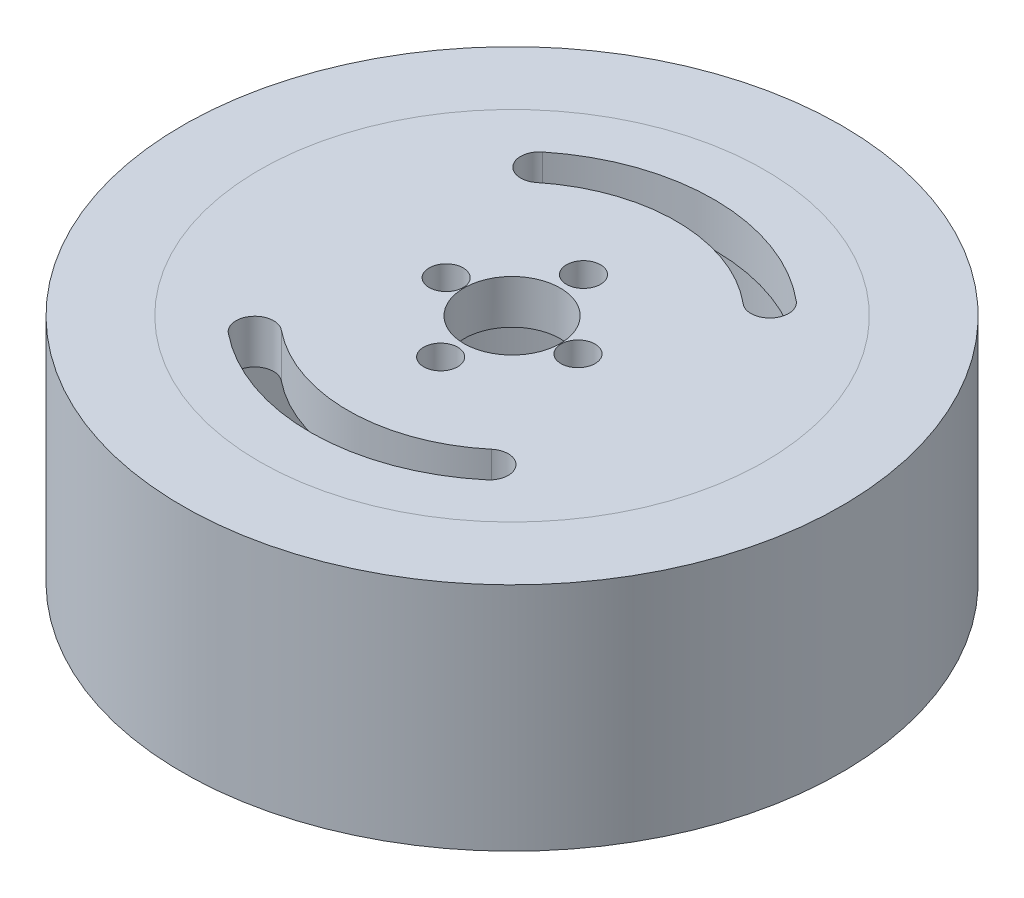
ISO-10303-21;
HEADER;
FILE_DESCRIPTION(('STEP AP214'),'2;1');
FILE_NAME('part.step','',(''),(''),'','','');
FILE_SCHEMA(('AUTOMOTIVE_DESIGN { 1 0 10303 214 1 1 1 1 }'));
ENDSEC;
DATA;
#1=APPLICATION_CONTEXT('core data for automotive mechanical design processes');
#2=APPLICATION_PROTOCOL_DEFINITION('international standard','automotive_design',2000,#1);
#3=PRODUCT_CONTEXT('',#1,'mechanical');
#4=PRODUCT('Part','Part','',(#3));
#5=PRODUCT_RELATED_PRODUCT_CATEGORY('part','',(#4));
#6=PRODUCT_DEFINITION_FORMATION('','',#4);
#7=PRODUCT_DEFINITION_CONTEXT('part definition',#1,'design');
#8=PRODUCT_DEFINITION('design','',#6,#7);
#9=PRODUCT_DEFINITION_SHAPE('','',#8);
#10=(LENGTH_UNIT() NAMED_UNIT(*) SI_UNIT(.MILLI.,.METRE.));
#11=(NAMED_UNIT(*) PLANE_ANGLE_UNIT() SI_UNIT($,.RADIAN.));
#12=(NAMED_UNIT(*) SI_UNIT($,.STERADIAN.) SOLID_ANGLE_UNIT());
#13=UNCERTAINTY_MEASURE_WITH_UNIT(LENGTH_MEASURE(1.E-05),#10,'distance_accuracy_value','');
#14=(GEOMETRIC_REPRESENTATION_CONTEXT(3) GLOBAL_UNCERTAINTY_ASSIGNED_CONTEXT((#13)) GLOBAL_UNIT_ASSIGNED_CONTEXT((#10,
#11,#12)) REPRESENTATION_CONTEXT('',''));
#15=CARTESIAN_POINT('',(0.,0.,0.));
#16=DIRECTION('',(0.,0.,1.));
#17=DIRECTION('',(1.,0.,0.));
#18=AXIS2_PLACEMENT_3D('',#15,#16,#17);
#19=CARTESIAN_POINT('',(0.,21.,0.));
#20=DIRECTION('',(0.,1.,0.));
#21=DIRECTION('',(0.,0.,1.));
#22=AXIS2_PLACEMENT_3D('',#19,#20,#21);
#23=PLANE('',#22);
#24=CARTESIAN_POINT('',(0.,21.,0.));
#25=DIRECTION('',(0.,1.,0.));
#26=DIRECTION('',(0.,0.,1.));
#27=AXIS2_PLACEMENT_3D('',#24,#25,#26);
#28=CIRCLE('',#27,30.);
#29=CARTESIAN_POINT('',(0.,21.,-30.));
#30=VERTEX_POINT('',#29);
#31=EDGE_CURVE('E180',#30,#30,#28,.T.);
#32=ORIENTED_EDGE('',*,*,#31,.T.);
#33=EDGE_LOOP('',(#32));
#34=FACE_BOUND('',#33,.T.);
#35=CARTESIAN_POINT('',(0.,21.,0.));
#36=DIRECTION('',(0.,1.,0.));
#37=DIRECTION('',(0.,0.,1.));
#38=AXIS2_PLACEMENT_3D('',#35,#36,#37);
#39=CIRCLE('',#38,23.);
#40=CARTESIAN_POINT('',(0.,21.,23.));
#41=VERTEX_POINT('',#40);
#42=EDGE_CURVE('E186',#41,#41,#39,.F.);
#43=ORIENTED_EDGE('',*,*,#42,.T.);
#44=EDGE_LOOP('',(#43));
#45=FACE_BOUND('',#44,.T.);
#46=ADVANCED_FACE('F40',(#34,#45),#23,.T.);
#47=CARTESIAN_POINT('',(0.,0.,0.));
#48=DIRECTION('',(0.,1.,0.));
#49=DIRECTION('',(0.,0.,1.));
#50=AXIS2_PLACEMENT_3D('',#47,#48,#49);
#51=PLANE('',#50);
#52=CARTESIAN_POINT('',(0.,0.,0.));
#53=DIRECTION('',(0.,1.,0.));
#54=DIRECTION('',(0.,0.,1.));
#55=AXIS2_PLACEMENT_3D('',#52,#53,#54);
#56=CIRCLE('',#55,30.);
#57=CARTESIAN_POINT('',(0.,0.,-30.));
#58=VERTEX_POINT('',#57);
#59=EDGE_CURVE('E176',#58,#58,#56,.T.);
#60=ORIENTED_EDGE('',*,*,#59,.F.);
#61=EDGE_LOOP('',(#60));
#62=FACE_BOUND('',#61,.T.);
#63=CARTESIAN_POINT('',(0.,0.,0.));
#64=DIRECTION('',(0.,1.,0.));
#65=DIRECTION('',(0.,0.,1.));
#66=AXIS2_PLACEMENT_3D('',#63,#64,#65);
#67=CIRCLE('',#66,23.);
#68=CARTESIAN_POINT('',(0.,0.,23.));
#69=VERTEX_POINT('',#68);
#70=EDGE_CURVE('E183',#69,#69,#67,.F.);
#71=ORIENTED_EDGE('',*,*,#70,.F.);
#72=EDGE_LOOP('',(#71));
#73=FACE_BOUND('',#72,.T.);
#74=ADVANCED_FACE('F253',(#62,#73),#51,.F.);
#75=CARTESIAN_POINT('',(0.,21.,0.));
#76=DIRECTION('',(0.,-1.,0.));
#77=DIRECTION('',(0.,0.,-1.));
#78=AXIS2_PLACEMENT_3D('',#75,#76,#77);
#79=CYLINDRICAL_SURFACE('',#78,30.);
#80=CARTESIAN_POINT('',(0.,21.,-30.));
#81=CARTESIAN_POINT('',(0.,20.78125,-30.));
#82=CARTESIAN_POINT('',(0.,20.5625,-30.));
#83=CARTESIAN_POINT('',(0.,20.125,-30.));
#84=CARTESIAN_POINT('',(0.,19.90625,-30.));
#85=CARTESIAN_POINT('',(0.,19.46875,-30.));
#86=CARTESIAN_POINT('',(0.,19.25,-30.));
#87=CARTESIAN_POINT('',(0.,18.8125,-30.));
#88=CARTESIAN_POINT('',(0.,18.59375,-30.));
#89=CARTESIAN_POINT('',(0.,18.15625,-30.));
#90=CARTESIAN_POINT('',(0.,17.9375,-30.));
#91=CARTESIAN_POINT('',(0.,17.5,-30.));
#92=CARTESIAN_POINT('',(0.,17.28125,-30.));
#93=CARTESIAN_POINT('',(0.,16.84375,-30.));
#94=CARTESIAN_POINT('',(0.,16.625,-30.));
#95=CARTESIAN_POINT('',(0.,16.1875,-30.));
#96=CARTESIAN_POINT('',(0.,15.96875,-30.));
#97=CARTESIAN_POINT('',(0.,15.53125,-30.));
#98=CARTESIAN_POINT('',(0.,15.3125,-30.));
#99=CARTESIAN_POINT('',(0.,14.875,-30.));
#100=CARTESIAN_POINT('',(0.,14.65625,-30.));
#101=CARTESIAN_POINT('',(0.,14.21875,-30.));
#102=CARTESIAN_POINT('',(0.,14.,-30.));
#103=CARTESIAN_POINT('',(0.,13.5625,-30.));
#104=CARTESIAN_POINT('',(0.,13.34375,-30.));
#105=CARTESIAN_POINT('',(0.,12.90625,-30.));
#106=CARTESIAN_POINT('',(0.,12.6875,-30.));
#107=CARTESIAN_POINT('',(0.,12.25,-30.));
#108=CARTESIAN_POINT('',(0.,12.03125,-30.));
#109=CARTESIAN_POINT('',(0.,11.59375,-30.));
#110=CARTESIAN_POINT('',(0.,11.375,-30.));
#111=CARTESIAN_POINT('',(0.,10.9375,-30.));
#112=CARTESIAN_POINT('',(0.,10.71875,-30.));
#113=CARTESIAN_POINT('',(0.,10.28125,-30.));
#114=CARTESIAN_POINT('',(0.,10.0625,-30.));
#115=CARTESIAN_POINT('',(0.,9.625,-30.));
#116=CARTESIAN_POINT('',(0.,9.40625,-30.));
#117=CARTESIAN_POINT('',(0.,8.96875,-30.));
#118=CARTESIAN_POINT('',(0.,8.75,-30.));
#119=CARTESIAN_POINT('',(0.,8.3125,-30.));
#120=CARTESIAN_POINT('',(0.,8.09375,-30.));
#121=CARTESIAN_POINT('',(0.,7.65625,-30.));
#122=CARTESIAN_POINT('',(0.,7.4375,-30.));
#123=CARTESIAN_POINT('',(0.,7.,-30.));
#124=CARTESIAN_POINT('',(0.,6.78125,-30.));
#125=CARTESIAN_POINT('',(0.,6.34375,-30.));
#126=CARTESIAN_POINT('',(0.,6.125,-30.));
#127=CARTESIAN_POINT('',(0.,5.6875,-30.));
#128=CARTESIAN_POINT('',(0.,5.46875,-30.));
#129=CARTESIAN_POINT('',(0.,5.03125,-30.));
#130=CARTESIAN_POINT('',(0.,4.8125,-30.));
#131=CARTESIAN_POINT('',(0.,4.375,-30.));
#132=CARTESIAN_POINT('',(0.,4.15625,-30.));
#133=CARTESIAN_POINT('',(0.,3.71875,-30.));
#134=CARTESIAN_POINT('',(0.,3.5,-30.));
#135=CARTESIAN_POINT('',(0.,3.0625,-30.));
#136=CARTESIAN_POINT('',(0.,2.84375,-30.));
#137=CARTESIAN_POINT('',(0.,2.40625,-30.));
#138=CARTESIAN_POINT('',(0.,2.1875,-30.));
#139=CARTESIAN_POINT('',(0.,1.75,-30.));
#140=CARTESIAN_POINT('',(0.,1.53125,-30.));
#141=CARTESIAN_POINT('',(0.,1.09375,-30.));
#142=CARTESIAN_POINT('',(0.,0.875000000000001,-30.));
#143=CARTESIAN_POINT('',(0.,0.4375,-30.));
#144=CARTESIAN_POINT('',(0.,0.21875,-30.));
#145=CARTESIAN_POINT('',(0.,0.,-30.));
#146=B_SPLINE_CURVE_WITH_KNOTS('',3,(#80,#81,#82,#83,#84,#85,#86,#87,#88,#89,#90,#91,#92,#93,
#94,#95,#96,#97,#98,#99,#100,#101,#102,#103,#104,#105,#106,#107,#108,#109,#110,#111,#112,#113,
#114,#115,#116,#117,#118,#119,#120,#121,#122,#123,#124,#125,#126,#127,#128,#129,#130,#131,#132,
#133,#134,#135,#136,#137,#138,#139,#140,#141,#142,#143,#144,#145),.UNSPECIFIED.,.F.,.F.,(4,2,2,
2,2,2,2,2,2,2,2,2,2,2,2,2,2,2,2,2,2,2,2,2,2,2,2,2,2,2,2,2,4),(0.,0.656249999999997,1.3125,
1.96875,2.625,3.28125,3.9375,4.59375,5.25,5.90625,6.5625,7.21875,7.875,8.53125,9.1875,9.84375,
10.5,11.15625,11.8125,12.46875,13.125,13.78125,14.4375,15.09375,15.75,16.40625,17.0625,17.71875,
18.375,19.03125,19.6875,20.34375,21.),.UNSPECIFIED.);
#147=EDGE_CURVE('BSEAM42',#30,#58,#146,.T.);
#148=ORIENTED_EDGE('',*,*,#31,.F.);
#149=ORIENTED_EDGE('',*,*,#59,.T.);
#150=ORIENTED_EDGE('',*,*,#147,.T.);
#151=ORIENTED_EDGE('',*,*,#147,.F.);
#152=EDGE_LOOP('',(#148,#150,#149,#151));
#153=FACE_BOUND('',#152,.T.);
#154=ADVANCED_FACE('F42',(#153),#79,.T.);
#155=CARTESIAN_POINT('',(0.,21.,0.));
#156=DIRECTION('',(0.,1.,0.));
#157=DIRECTION('',(0.,0.,1.));
#158=AXIS2_PLACEMENT_3D('',#155,#156,#157);
#159=CIRCLE('',#158,4.38448940135771);
#160=CARTESIAN_POINT('',(0.,21.,4.38448940135771));
#161=VERTEX_POINT('',#160);
#162=EDGE_CURVE('E137',#161,#161,#159,.T.);
#163=ORIENTED_EDGE('',*,*,#162,.F.);
#164=EDGE_LOOP('',(#163));
#165=FACE_BOUND('',#164,.T.);
#166=CARTESIAN_POINT('',(0.,21.,6.5));
#167=DIRECTION('',(0.,1.,0.));
#168=DIRECTION('',(0.,0.,1.));
#169=AXIS2_PLACEMENT_3D('',#166,#167,#168);
#170=CIRCLE('',#169,1.55);
#171=CARTESIAN_POINT('',(0.,21.,8.05));
#172=VERTEX_POINT('',#171);
#173=EDGE_CURVE('E158',#172,#172,#170,.T.);
#174=ORIENTED_EDGE('',*,*,#173,.F.);
#175=EDGE_LOOP('',(#174));
#176=FACE_BOUND('',#175,.T.);
#177=CARTESIAN_POINT('',(6.,21.,0.));
#178=DIRECTION('',(0.,1.,0.));
#179=DIRECTION('',(0.,0.,1.));
#180=AXIS2_PLACEMENT_3D('',#177,#178,#179);
#181=CIRCLE('',#180,1.55);
#182=CARTESIAN_POINT('',(6.,21.,1.55));
#183=VERTEX_POINT('',#182);
#184=EDGE_CURVE('E161',#183,#183,#181,.T.);
#185=ORIENTED_EDGE('',*,*,#184,.F.);
#186=EDGE_LOOP('',(#185));
#187=FACE_BOUND('',#186,.T.);
#188=CARTESIAN_POINT('',(0.,21.,-6.5));
#189=DIRECTION('',(0.,1.,0.));
#190=DIRECTION('',(0.,0.,1.));
#191=AXIS2_PLACEMENT_3D('',#188,#189,#190);
#192=CIRCLE('',#191,1.55);
#193=CARTESIAN_POINT('',(0.,21.,-4.95));
#194=VERTEX_POINT('',#193);
#195=EDGE_CURVE('E164',#194,#194,#192,.T.);
#196=ORIENTED_EDGE('',*,*,#195,.F.);
#197=EDGE_LOOP('',(#196));
#198=FACE_BOUND('',#197,.T.);
#199=CARTESIAN_POINT('',(10.6968094714254,21.,-12.7632385738599));
#200=DIRECTION('',(0.,1.,0.));
#201=DIRECTION('',(0.,0.,1.));
#202=AXIS2_PLACEMENT_3D('',#199,#200,#201);
#203=CIRCLE('',#202,1.71459798128408);
#204=CARTESIAN_POINT('',(9.5954618630093,21.,-11.4491306319998));
#205=VERTEX_POINT('',#204);
#206=CARTESIAN_POINT('',(11.7981570798414,21.,-14.0773465157199));
#207=VERTEX_POINT('',#206);
#208=EDGE_CURVE('E57',#205,#207,#203,.T.);
#209=ORIENTED_EDGE('',*,*,#208,.F.);
#210=CARTESIAN_POINT('',(0.,21.,0.));
#211=DIRECTION('',(0.,-1.,0.));
#212=DIRECTION('',(0.,0.,1.));
#213=AXIS2_PLACEMENT_3D('',#210,#211,#212);
#214=CIRCLE('',#213,14.9383894912759);
#215=CARTESIAN_POINT('',(-9.38549104250814,21.,-11.6218775799809));
#216=VERTEX_POINT('',#215);
#217=EDGE_CURVE('E130',#216,#205,#214,.T.);
#218=ORIENTED_EDGE('',*,*,#217,.F.);
#219=CARTESIAN_POINT('',(-10.4627386269444,21.,-12.955813065396));
#220=DIRECTION('',(0.,1.,0.));
#221=DIRECTION('',(0.,0.,1.));
#222=AXIS2_PLACEMENT_3D('',#219,#220,#221);
#223=CIRCLE('',#222,1.71459798128408);
#224=CARTESIAN_POINT('',(-11.5399862113806,21.,-14.2897485508112));
#225=VERTEX_POINT('',#224);
#226=EDGE_CURVE('E113',#225,#216,#223,.T.);
#227=ORIENTED_EDGE('',*,*,#226,.F.);
#228=CARTESIAN_POINT('',(0.,21.,0.));
#229=DIRECTION('',(0.,1.,0.));
#230=DIRECTION('',(0.,0.,1.));
#231=AXIS2_PLACEMENT_3D('',#228,#229,#230);
#232=CIRCLE('',#231,18.3675854538441);
#233=EDGE_CURVE('E123',#207,#225,#232,.T.);
#234=ORIENTED_EDGE('',*,*,#233,.F.);
#235=EDGE_LOOP('',(#209,#218,#227,#234));
#236=FACE_BOUND('',#235,.T.);
#237=CARTESIAN_POINT('',(10.6968094714254,21.,12.7632385738599));
#238=DIRECTION('',(0.,1.,0.));
#239=DIRECTION('',(0.,0.,-1.));
#240=AXIS2_PLACEMENT_3D('',#237,#238,#239);
#241=CIRCLE('',#240,1.71459798128409);
#242=CARTESIAN_POINT('',(11.7981570798414,21.,14.0773465157199));
#243=VERTEX_POINT('',#242);
#244=CARTESIAN_POINT('',(9.59546186300931,21.,11.4491306319998));
#245=VERTEX_POINT('',#244);
#246=EDGE_CURVE('E65',#243,#245,#241,.T.);
#247=ORIENTED_EDGE('',*,*,#246,.F.);
#248=CARTESIAN_POINT('',(0.,21.,0.));
#249=DIRECTION('',(0.,1.,0.));
#250=DIRECTION('',(0.,0.,-1.));
#251=AXIS2_PLACEMENT_3D('',#248,#249,#250);
#252=CIRCLE('',#251,18.3675854538441);
#253=CARTESIAN_POINT('',(-11.5399862113806,21.,14.2897485508112));
#254=VERTEX_POINT('',#253);
#255=EDGE_CURVE('E147',#254,#243,#252,.T.);
#256=ORIENTED_EDGE('',*,*,#255,.F.);
#257=CARTESIAN_POINT('',(-10.4627386269443,21.,12.955813065396));
#258=DIRECTION('',(0.,1.,0.));
#259=DIRECTION('',(0.,0.,-1.));
#260=AXIS2_PLACEMENT_3D('',#257,#258,#259);
#261=CIRCLE('',#260,1.71459798128408);
#262=CARTESIAN_POINT('',(-9.38549104250813,21.,11.6218775799809));
#263=VERTEX_POINT('',#262);
#264=EDGE_CURVE('E144',#263,#254,#261,.T.);
#265=ORIENTED_EDGE('',*,*,#264,.F.);
#266=CARTESIAN_POINT('',(0.,21.,0.));
#267=DIRECTION('',(0.,-1.,0.));
#268=DIRECTION('',(0.,0.,-1.));
#269=AXIS2_PLACEMENT_3D('',#266,#267,#268);
#270=CIRCLE('',#269,14.9383894912759);
#271=EDGE_CURVE('E141',#245,#263,#270,.T.);
#272=ORIENTED_EDGE('',*,*,#271,.F.);
#273=EDGE_LOOP('',(#247,#256,#265,#272));
#274=FACE_BOUND('',#273,.T.);
#275=CARTESIAN_POINT('',(-6.,21.,0.));
#276=DIRECTION('',(0.,1.,0.));
#277=DIRECTION('',(0.,0.,1.));
#278=AXIS2_PLACEMENT_3D('',#275,#276,#277);
#279=CIRCLE('',#278,1.55);
#280=CARTESIAN_POINT('',(-6.,21.,1.55));
#281=VERTEX_POINT('',#280);
#282=EDGE_CURVE('E167',#281,#281,#279,.T.);
#283=ORIENTED_EDGE('',*,*,#282,.F.);
#284=EDGE_LOOP('',(#283));
#285=FACE_BOUND('',#284,.T.);
#286=ORIENTED_EDGE('',*,*,#42,.F.);
#287=EDGE_LOOP('',(#286));
#288=FACE_BOUND('',#287,.T.);
#289=ADVANCED_FACE('F127',(#165,#176,#187,#198,#236,#274,#285,#288),#23,.T.);
#290=ORIENTED_EDGE('',*,*,#70,.T.);
#291=EDGE_LOOP('',(#290));
#292=FACE_BOUND('',#291,.T.);
#293=CARTESIAN_POINT('',(0.,0.,0.));
#294=DIRECTION('',(0.,-1.,0.));
#295=DIRECTION('',(0.,0.,-1.));
#296=AXIS2_PLACEMENT_3D('',#293,#294,#295);
#297=CIRCLE('',#296,21.);
#298=CARTESIAN_POINT('',(0.,0.,-21.));
#299=VERTEX_POINT('',#298);
#300=EDGE_CURVE('E177',#299,#299,#297,.T.);
#301=ORIENTED_EDGE('',*,*,#300,.F.);
#302=EDGE_LOOP('',(#301));
#303=FACE_BOUND('',#302,.T.);
#304=ADVANCED_FACE('F247',(#292,#303),#51,.F.);
#305=CARTESIAN_POINT('',(0.,17.,0.));
#306=DIRECTION('',(0.,-1.,0.));
#307=DIRECTION('',(0.,0.,-1.));
#308=AXIS2_PLACEMENT_3D('',#305,#306,#307);
#309=CYLINDRICAL_SURFACE('',#308,21.);
#310=CARTESIAN_POINT('',(0.,17.,0.));
#311=DIRECTION('',(0.,-1.,0.));
#312=DIRECTION('',(0.,0.,-1.));
#313=AXIS2_PLACEMENT_3D('',#310,#311,#312);
#314=CIRCLE('',#313,21.);
#315=CARTESIAN_POINT('',(0.,17.,-21.));
#316=VERTEX_POINT('',#315);
#317=EDGE_CURVE('E173',#316,#316,#314,.T.);
#318=ORIENTED_EDGE('',*,*,#317,.F.);
#319=EDGE_LOOP('',(#318));
#320=FACE_BOUND('',#319,.T.);
#321=ORIENTED_EDGE('',*,*,#300,.T.);
#322=EDGE_LOOP('',(#321));
#323=FACE_BOUND('',#322,.T.);
#324=ADVANCED_FACE('F227',(#320,#323),#309,.F.);
#325=CARTESIAN_POINT('',(0.,17.,0.));
#326=DIRECTION('',(0.,-1.,0.));
#327=DIRECTION('',(0.,0.,-1.));
#328=AXIS2_PLACEMENT_3D('',#325,#326,#327);
#329=PLANE('',#328);
#330=CARTESIAN_POINT('',(0.,17.,0.));
#331=DIRECTION('',(0.,-1.,0.));
#332=DIRECTION('',(0.,0.,-1.));
#333=AXIS2_PLACEMENT_3D('',#330,#331,#332);
#334=CIRCLE('',#333,4.38448940135771);
#335=CARTESIAN_POINT('',(0.,17.,-4.38448940135771));
#336=VERTEX_POINT('',#335);
#337=EDGE_CURVE('E44',#336,#336,#334,.T.);
#338=ORIENTED_EDGE('',*,*,#337,.F.);
#339=EDGE_LOOP('',(#338));
#340=FACE_BOUND('',#339,.T.);
#341=CARTESIAN_POINT('',(0.,17.,6.5));
#342=DIRECTION('',(0.,-1.,0.));
#343=DIRECTION('',(0.,0.,-1.));
#344=AXIS2_PLACEMENT_3D('',#341,#342,#343);
#345=CIRCLE('',#344,1.55);
#346=CARTESIAN_POINT('',(0.,17.,4.95));
#347=VERTEX_POINT('',#346);
#348=EDGE_CURVE('E213',#347,#347,#345,.T.);
#349=ORIENTED_EDGE('',*,*,#348,.F.);
#350=EDGE_LOOP('',(#349));
#351=FACE_BOUND('',#350,.T.);
#352=CARTESIAN_POINT('',(6.,17.,0.));
#353=DIRECTION('',(0.,-1.,0.));
#354=DIRECTION('',(0.,0.,-1.));
#355=AXIS2_PLACEMENT_3D('',#352,#353,#354);
#356=CIRCLE('',#355,1.55);
#357=CARTESIAN_POINT('',(6.,17.,-1.55));
#358=VERTEX_POINT('',#357);
#359=EDGE_CURVE('E211',#358,#358,#356,.T.);
#360=ORIENTED_EDGE('',*,*,#359,.F.);
#361=EDGE_LOOP('',(#360));
#362=FACE_BOUND('',#361,.T.);
#363=CARTESIAN_POINT('',(0.,17.,-6.5));
#364=DIRECTION('',(0.,-1.,0.));
#365=DIRECTION('',(0.,0.,-1.));
#366=AXIS2_PLACEMENT_3D('',#363,#364,#365);
#367=CIRCLE('',#366,1.55);
#368=CARTESIAN_POINT('',(0.,17.,-8.05));
#369=VERTEX_POINT('',#368);
#370=EDGE_CURVE('E196',#369,#369,#367,.T.);
#371=ORIENTED_EDGE('',*,*,#370,.F.);
#372=EDGE_LOOP('',(#371));
#373=FACE_BOUND('',#372,.T.);
#374=CARTESIAN_POINT('',(10.6968094714254,17.,-12.7632385738599));
#375=DIRECTION('',(0.,-1.,0.));
#376=DIRECTION('',(0.,0.,-1.));
#377=AXIS2_PLACEMENT_3D('',#374,#375,#376);
#378=CIRCLE('',#377,1.71459798128408);
#379=CARTESIAN_POINT('',(11.7981570798414,17.,-14.0773465157199));
#380=VERTEX_POINT('',#379);
#381=CARTESIAN_POINT('',(9.5954618630093,17.,-11.4491306319998));
#382=VERTEX_POINT('',#381);
#383=EDGE_CURVE('E11',#380,#382,#378,.T.);
#384=ORIENTED_EDGE('',*,*,#383,.F.);
#385=CARTESIAN_POINT('',(0.,17.,0.));
#386=DIRECTION('',(0.,-1.,0.));
#387=DIRECTION('',(0.,0.,-1.));
#388=AXIS2_PLACEMENT_3D('',#385,#386,#387);
#389=CIRCLE('',#388,18.3675854538441);
#390=CARTESIAN_POINT('',(-11.5399862113806,17.,-14.2897485508112));
#391=VERTEX_POINT('',#390);
#392=EDGE_CURVE('E205',#391,#380,#389,.T.);
#393=ORIENTED_EDGE('',*,*,#392,.F.);
#394=CARTESIAN_POINT('',(-10.4627386269444,17.,-12.955813065396));
#395=DIRECTION('',(0.,-1.,0.));
#396=DIRECTION('',(0.,0.,-1.));
#397=AXIS2_PLACEMENT_3D('',#394,#395,#396);
#398=CIRCLE('',#397,1.71459798128408);
#399=CARTESIAN_POINT('',(-9.38549104250814,17.,-11.6218775799809));
#400=VERTEX_POINT('',#399);
#401=EDGE_CURVE('E116',#400,#391,#398,.T.);
#402=ORIENTED_EDGE('',*,*,#401,.F.);
#403=CARTESIAN_POINT('',(0.,17.,0.));
#404=DIRECTION('',(0.,-1.,0.));
#405=DIRECTION('',(0.,0.,-1.));
#406=AXIS2_PLACEMENT_3D('',#403,#404,#405);
#407=CIRCLE('',#406,14.9383894912759);
#408=EDGE_CURVE('E49',#382,#400,#407,.F.);
#409=ORIENTED_EDGE('',*,*,#408,.F.);
#410=EDGE_LOOP('',(#384,#393,#402,#409));
#411=FACE_BOUND('',#410,.T.);
#412=CARTESIAN_POINT('',(10.6968094714254,17.,12.7632385738599));
#413=DIRECTION('',(0.,-1.,0.));
#414=DIRECTION('',(0.,0.,-1.));
#415=AXIS2_PLACEMENT_3D('',#412,#413,#414);
#416=CIRCLE('',#415,1.71459798128409);
#417=CARTESIAN_POINT('',(9.59546186300931,17.,11.4491306319998));
#418=VERTEX_POINT('',#417);
#419=CARTESIAN_POINT('',(11.7981570798414,17.,14.0773465157199));
#420=VERTEX_POINT('',#419);
#421=EDGE_CURVE('E203',#418,#420,#416,.T.);
#422=ORIENTED_EDGE('',*,*,#421,.F.);
#423=CARTESIAN_POINT('',(0.,17.,0.));
#424=DIRECTION('',(0.,-1.,0.));
#425=DIRECTION('',(0.,0.,-1.));
#426=AXIS2_PLACEMENT_3D('',#423,#424,#425);
#427=CIRCLE('',#426,14.9383894912759);
#428=CARTESIAN_POINT('',(-9.38549104250814,17.,11.6218775799809));
#429=VERTEX_POINT('',#428);
#430=EDGE_CURVE('E190',#429,#418,#427,.F.);
#431=ORIENTED_EDGE('',*,*,#430,.F.);
#432=CARTESIAN_POINT('',(-10.4627386269443,17.,12.955813065396));
#433=DIRECTION('',(0.,-1.,0.));
#434=DIRECTION('',(0.,0.,-1.));
#435=AXIS2_PLACEMENT_3D('',#432,#433,#434);
#436=CIRCLE('',#435,1.71459798128408);
#437=CARTESIAN_POINT('',(-11.5399862113806,17.,14.2897485508112));
#438=VERTEX_POINT('',#437);
#439=EDGE_CURVE('E198',#438,#429,#436,.T.);
#440=ORIENTED_EDGE('',*,*,#439,.F.);
#441=CARTESIAN_POINT('',(0.,17.,0.));
#442=DIRECTION('',(0.,-1.,0.));
#443=DIRECTION('',(0.,0.,-1.));
#444=AXIS2_PLACEMENT_3D('',#441,#442,#443);
#445=CIRCLE('',#444,18.3675854538441);
#446=EDGE_CURVE('E201',#420,#438,#445,.T.);
#447=ORIENTED_EDGE('',*,*,#446,.F.);
#448=EDGE_LOOP('',(#422,#431,#440,#447));
#449=FACE_BOUND('',#448,.T.);
#450=CARTESIAN_POINT('',(-6.,17.,0.));
#451=DIRECTION('',(0.,-1.,0.));
#452=DIRECTION('',(0.,0.,-1.));
#453=AXIS2_PLACEMENT_3D('',#450,#451,#452);
#454=CIRCLE('',#453,1.55);
#455=CARTESIAN_POINT('',(-6.,17.,-1.55));
#456=VERTEX_POINT('',#455);
#457=EDGE_CURVE('E172',#456,#456,#454,.T.);
#458=ORIENTED_EDGE('',*,*,#457,.F.);
#459=EDGE_LOOP('',(#458));
#460=FACE_BOUND('',#459,.T.);
#461=ORIENTED_EDGE('',*,*,#317,.T.);
#462=EDGE_LOOP('',(#461));
#463=FACE_BOUND('',#462,.T.);
#464=ADVANCED_FACE('F223',(#340,#351,#362,#373,#411,#449,#460,#463),#329,.T.);
#465=CARTESIAN_POINT('',(-6.,4.,0.));
#466=DIRECTION('',(0.,1.,0.));
#467=DIRECTION('',(0.,0.,1.));
#468=AXIS2_PLACEMENT_3D('',#465,#466,#467);
#469=CYLINDRICAL_SURFACE('',#468,1.55);
#470=ORIENTED_EDGE('',*,*,#457,.T.);
#471=EDGE_LOOP('',(#470));
#472=FACE_BOUND('',#471,.T.);
#473=ORIENTED_EDGE('',*,*,#282,.T.);
#474=EDGE_LOOP('',(#473));
#475=FACE_BOUND('',#474,.T.);
#476=ADVANCED_FACE('F226',(#472,#475),#469,.F.);
#477=CARTESIAN_POINT('',(10.6968094714254,4.,12.7632385738599));
#478=DIRECTION('',(0.,1.,0.));
#479=DIRECTION('',(0.,0.,1.));
#480=AXIS2_PLACEMENT_3D('',#477,#478,#479);
#481=CYLINDRICAL_SURFACE('',#480,1.71459798128409);
#482=ORIENTED_EDGE('',*,*,#421,.T.);
#483=DIRECTION('',(0.,1.,0.));
#484=VECTOR('',#483,1.);
#485=CARTESIAN_POINT('',(11.7981570798414,4.,14.0773465157199));
#486=LINE('',#485,#484);
#487=EDGE_CURVE('E151',#420,#243,#486,.T.);
#488=ORIENTED_EDGE('',*,*,#487,.T.);
#489=ORIENTED_EDGE('',*,*,#246,.T.);
#490=DIRECTION('',(0.,1.,0.));
#491=VECTOR('',#490,1.);
#492=CARTESIAN_POINT('',(9.59546186300931,4.,11.4491306319998));
#493=LINE('',#492,#491);
#494=EDGE_CURVE('E150',#418,#245,#493,.T.);
#495=ORIENTED_EDGE('',*,*,#494,.F.);
#496=EDGE_LOOP('',(#482,#488,#489,#495));
#497=FACE_BOUND('',#496,.T.);
#498=ADVANCED_FACE('F269',(#497),#481,.F.);
#499=CARTESIAN_POINT('',(0.,4.,0.));
#500=DIRECTION('',(0.,1.,0.));
#501=DIRECTION('',(0.,0.,1.));
#502=AXIS2_PLACEMENT_3D('',#499,#500,#501);
#503=CYLINDRICAL_SURFACE('',#502,18.3675854538441);
#504=ORIENTED_EDGE('',*,*,#446,.T.);
#505=DIRECTION('',(0.,1.,0.));
#506=VECTOR('',#505,1.);
#507=CARTESIAN_POINT('',(-11.5399862113806,4.,14.2897485508112));
#508=LINE('',#507,#506);
#509=EDGE_CURVE('E153',#438,#254,#508,.T.);
#510=ORIENTED_EDGE('',*,*,#509,.T.);
#511=ORIENTED_EDGE('',*,*,#255,.T.);
#512=ORIENTED_EDGE('',*,*,#487,.F.);
#513=EDGE_LOOP('',(#504,#510,#511,#512));
#514=FACE_BOUND('',#513,.T.);
#515=ADVANCED_FACE('F286',(#514),#503,.F.);
#516=CARTESIAN_POINT('',(-10.4627386269443,4.,12.955813065396));
#517=DIRECTION('',(0.,1.,0.));
#518=DIRECTION('',(0.,0.,1.));
#519=AXIS2_PLACEMENT_3D('',#516,#517,#518);
#520=CYLINDRICAL_SURFACE('',#519,1.71459798128408);
#521=ORIENTED_EDGE('',*,*,#439,.T.);
#522=DIRECTION('',(0.,1.,0.));
#523=VECTOR('',#522,1.);
#524=CARTESIAN_POINT('',(-9.38549104250813,4.,11.6218775799809));
#525=LINE('',#524,#523);
#526=EDGE_CURVE('E155',#429,#263,#525,.T.);
#527=ORIENTED_EDGE('',*,*,#526,.T.);
#528=ORIENTED_EDGE('',*,*,#264,.T.);
#529=ORIENTED_EDGE('',*,*,#509,.F.);
#530=EDGE_LOOP('',(#521,#527,#528,#529));
#531=FACE_BOUND('',#530,.T.);
#532=ADVANCED_FACE('F291',(#531),#520,.F.);
#533=CARTESIAN_POINT('',(0.,4.,0.));
#534=DIRECTION('',(0.,1.,0.));
#535=DIRECTION('',(0.,0.,1.));
#536=AXIS2_PLACEMENT_3D('',#533,#534,#535);
#537=CYLINDRICAL_SURFACE('',#536,14.9383894912759);
#538=ORIENTED_EDGE('',*,*,#430,.T.);
#539=ORIENTED_EDGE('',*,*,#494,.T.);
#540=ORIENTED_EDGE('',*,*,#271,.T.);
#541=ORIENTED_EDGE('',*,*,#526,.F.);
#542=EDGE_LOOP('',(#538,#539,#540,#541));
#543=FACE_BOUND('',#542,.T.);
#544=ADVANCED_FACE('F287',(#543),#537,.T.);
#545=CARTESIAN_POINT('',(10.6968094714254,4.,-12.7632385738599));
#546=DIRECTION('',(0.,1.,0.));
#547=DIRECTION('',(0.,0.,1.));
#548=AXIS2_PLACEMENT_3D('',#545,#546,#547);
#549=CYLINDRICAL_SURFACE('',#548,1.71459798128408);
#550=ORIENTED_EDGE('',*,*,#383,.T.);
#551=DIRECTION('',(0.,1.,0.));
#552=VECTOR('',#551,1.);
#553=CARTESIAN_POINT('',(9.5954618630093,4.,-11.4491306319998));
#554=LINE('',#553,#552);
#555=EDGE_CURVE('E135',#382,#205,#554,.T.);
#556=ORIENTED_EDGE('',*,*,#555,.T.);
#557=ORIENTED_EDGE('',*,*,#208,.T.);
#558=DIRECTION('',(0.,1.,0.));
#559=VECTOR('',#558,1.);
#560=CARTESIAN_POINT('',(11.7981570798414,4.,-14.0773465157199));
#561=LINE('',#560,#559);
#562=EDGE_CURVE('E120',#380,#207,#561,.T.);
#563=ORIENTED_EDGE('',*,*,#562,.F.);
#564=EDGE_LOOP('',(#550,#556,#557,#563));
#565=FACE_BOUND('',#564,.T.);
#566=ADVANCED_FACE('F290',(#565),#549,.F.);
#567=CARTESIAN_POINT('',(0.,4.,0.));
#568=DIRECTION('',(0.,1.,0.));
#569=DIRECTION('',(0.,0.,1.));
#570=AXIS2_PLACEMENT_3D('',#567,#568,#569);
#571=CYLINDRICAL_SURFACE('',#570,14.9383894912759);
#572=ORIENTED_EDGE('',*,*,#408,.T.);
#573=DIRECTION('',(0.,1.,0.));
#574=VECTOR('',#573,1.);
#575=CARTESIAN_POINT('',(-9.38549104250814,4.,-11.6218775799809));
#576=LINE('',#575,#574);
#577=EDGE_CURVE('E119',#400,#216,#576,.T.);
#578=ORIENTED_EDGE('',*,*,#577,.T.);
#579=ORIENTED_EDGE('',*,*,#217,.T.);
#580=ORIENTED_EDGE('',*,*,#555,.F.);
#581=EDGE_LOOP('',(#572,#578,#579,#580));
#582=FACE_BOUND('',#581,.T.);
#583=ADVANCED_FACE('F301',(#582),#571,.T.);
#584=CARTESIAN_POINT('',(-10.4627386269444,4.,-12.955813065396));
#585=DIRECTION('',(0.,1.,0.));
#586=DIRECTION('',(0.,0.,1.));
#587=AXIS2_PLACEMENT_3D('',#584,#585,#586);
#588=CYLINDRICAL_SURFACE('',#587,1.71459798128408);
#589=ORIENTED_EDGE('',*,*,#401,.T.);
#590=DIRECTION('',(0.,1.,0.));
#591=VECTOR('',#590,1.);
#592=CARTESIAN_POINT('',(-11.5399862113806,4.,-14.2897485508112));
#593=LINE('',#592,#591);
#594=EDGE_CURVE('E108',#391,#225,#593,.T.);
#595=ORIENTED_EDGE('',*,*,#594,.T.);
#596=ORIENTED_EDGE('',*,*,#226,.T.);
#597=ORIENTED_EDGE('',*,*,#577,.F.);
#598=EDGE_LOOP('',(#589,#595,#596,#597));
#599=FACE_BOUND('',#598,.T.);
#600=ADVANCED_FACE('F110',(#599),#588,.F.);
#601=CARTESIAN_POINT('',(0.,4.,0.));
#602=DIRECTION('',(0.,1.,0.));
#603=DIRECTION('',(0.,0.,1.));
#604=AXIS2_PLACEMENT_3D('',#601,#602,#603);
#605=CYLINDRICAL_SURFACE('',#604,18.3675854538441);
#606=ORIENTED_EDGE('',*,*,#392,.T.);
#607=ORIENTED_EDGE('',*,*,#562,.T.);
#608=ORIENTED_EDGE('',*,*,#233,.T.);
#609=ORIENTED_EDGE('',*,*,#594,.F.);
#610=EDGE_LOOP('',(#606,#607,#608,#609));
#611=FACE_BOUND('',#610,.T.);
#612=ADVANCED_FACE('F124',(#611),#605,.F.);
#613=CARTESIAN_POINT('',(0.,4.,-6.5));
#614=DIRECTION('',(0.,1.,0.));
#615=DIRECTION('',(0.,0.,1.));
#616=AXIS2_PLACEMENT_3D('',#613,#614,#615);
#617=CYLINDRICAL_SURFACE('',#616,1.55);
#618=ORIENTED_EDGE('',*,*,#370,.T.);
#619=EDGE_LOOP('',(#618));
#620=FACE_BOUND('',#619,.T.);
#621=ORIENTED_EDGE('',*,*,#195,.T.);
#622=EDGE_LOOP('',(#621));
#623=FACE_BOUND('',#622,.T.);
#624=ADVANCED_FACE('F275',(#620,#623),#617,.F.);
#625=CARTESIAN_POINT('',(6.,4.,0.));
#626=DIRECTION('',(0.,1.,0.));
#627=DIRECTION('',(0.,0.,1.));
#628=AXIS2_PLACEMENT_3D('',#625,#626,#627);
#629=CYLINDRICAL_SURFACE('',#628,1.55);
#630=ORIENTED_EDGE('',*,*,#359,.T.);
#631=EDGE_LOOP('',(#630));
#632=FACE_BOUND('',#631,.T.);
#633=ORIENTED_EDGE('',*,*,#184,.T.);
#634=EDGE_LOOP('',(#633));
#635=FACE_BOUND('',#634,.T.);
#636=ADVANCED_FACE('F271',(#632,#635),#629,.F.);
#637=CARTESIAN_POINT('',(0.,4.,6.5));
#638=DIRECTION('',(0.,1.,0.));
#639=DIRECTION('',(0.,0.,1.));
#640=AXIS2_PLACEMENT_3D('',#637,#638,#639);
#641=CYLINDRICAL_SURFACE('',#640,1.55);
#642=ORIENTED_EDGE('',*,*,#348,.T.);
#643=EDGE_LOOP('',(#642));
#644=FACE_BOUND('',#643,.T.);
#645=ORIENTED_EDGE('',*,*,#173,.T.);
#646=EDGE_LOOP('',(#645));
#647=FACE_BOUND('',#646,.T.);
#648=ADVANCED_FACE('F274',(#644,#647),#641,.F.);
#649=CARTESIAN_POINT('',(0.,4.,0.));
#650=DIRECTION('',(0.,1.,0.));
#651=DIRECTION('',(0.,0.,1.));
#652=AXIS2_PLACEMENT_3D('',#649,#650,#651);
#653=CYLINDRICAL_SURFACE('',#652,4.38448940135771);
#654=ORIENTED_EDGE('',*,*,#337,.T.);
#655=EDGE_LOOP('',(#654));
#656=FACE_BOUND('',#655,.T.);
#657=ORIENTED_EDGE('',*,*,#162,.T.);
#658=EDGE_LOOP('',(#657));
#659=FACE_BOUND('',#658,.T.);
#660=ADVANCED_FACE('F220',(#656,#659),#653,.F.);
#661=CLOSED_SHELL('',(#46,#74,#154,#289,#304,#324,#464,#476,#498,#515,#532,#544,#566,#583,#600,
#612,#624,#636,#648,#660));
#662=MANIFOLD_SOLID_BREP('B2',#661);
#663=ADVANCED_BREP_SHAPE_REPRESENTATION('',(#18,#662),#14);
#664=SHAPE_DEFINITION_REPRESENTATION(#9,#663);
ENDSEC;
END-ISO-10303-21;
